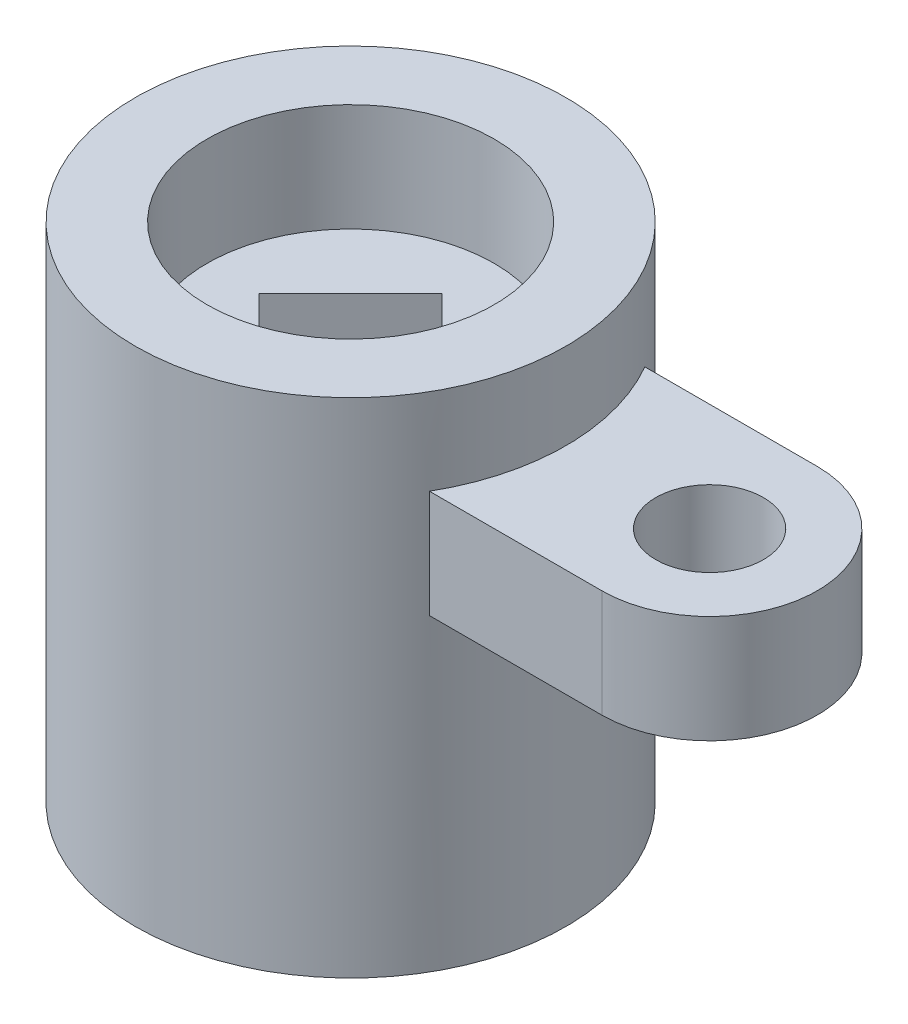
ISO-10303-21;
HEADER;
FILE_DESCRIPTION(('STEP AP214'),'2;1');
FILE_NAME('part.step','',(''),(''),'','','');
FILE_SCHEMA(('AUTOMOTIVE_DESIGN { 1 0 10303 214 1 1 1 1 }'));
ENDSEC;
DATA;
#1=APPLICATION_CONTEXT('core data for automotive mechanical design processes');
#2=APPLICATION_PROTOCOL_DEFINITION('international standard','automotive_design',2000,#1);
#3=PRODUCT_CONTEXT('',#1,'mechanical');
#4=PRODUCT('Part','Part','',(#3));
#5=PRODUCT_RELATED_PRODUCT_CATEGORY('part','',(#4));
#6=PRODUCT_DEFINITION_FORMATION('','',#4);
#7=PRODUCT_DEFINITION_CONTEXT('part definition',#1,'design');
#8=PRODUCT_DEFINITION('design','',#6,#7);
#9=PRODUCT_DEFINITION_SHAPE('','',#8);
#10=(LENGTH_UNIT() NAMED_UNIT(*) SI_UNIT(.MILLI.,.METRE.));
#11=(NAMED_UNIT(*) PLANE_ANGLE_UNIT() SI_UNIT($,.RADIAN.));
#12=(NAMED_UNIT(*) SI_UNIT($,.STERADIAN.) SOLID_ANGLE_UNIT());
#13=UNCERTAINTY_MEASURE_WITH_UNIT(LENGTH_MEASURE(1.E-05),#10,'distance_accuracy_value','');
#14=(GEOMETRIC_REPRESENTATION_CONTEXT(3) GLOBAL_UNCERTAINTY_ASSIGNED_CONTEXT((#13)) GLOBAL_UNIT_ASSIGNED_CONTEXT((#10,
#11,#12)) REPRESENTATION_CONTEXT('',''));
#15=CARTESIAN_POINT('',(0.,0.,0.));
#16=DIRECTION('',(0.,0.,1.));
#17=DIRECTION('',(1.,0.,0.));
#18=AXIS2_PLACEMENT_3D('',#15,#16,#17);
#19=CARTESIAN_POINT('',(0.,70.,0.));
#20=DIRECTION('',(0.,-1.,0.));
#21=DIRECTION('',(0.,0.,-1.));
#22=AXIS2_PLACEMENT_3D('',#19,#20,#21);
#23=CYLINDRICAL_SURFACE('',#22,30.);
#24=CARTESIAN_POINT('',(0.,0.,0.));
#25=DIRECTION('',(0.,1.,0.));
#26=DIRECTION('',(0.,0.,1.));
#27=AXIS2_PLACEMENT_3D('',#24,#25,#26);
#28=CIRCLE('',#27,30.);
#29=CARTESIAN_POINT('',(0.,0.,30.));
#30=VERTEX_POINT('',#29);
#31=EDGE_CURVE('E52',#30,#30,#28,.T.);
#32=ORIENTED_EDGE('',*,*,#31,.T.);
#33=EDGE_LOOP('',(#32));
#34=FACE_BOUND('',#33,.T.);
#35=CARTESIAN_POINT('',(0.,70.,0.));
#36=DIRECTION('',(0.,1.,0.));
#37=DIRECTION('',(0.,0.,1.));
#38=AXIS2_PLACEMENT_3D('',#35,#36,#37);
#39=CIRCLE('',#38,30.);
#40=CARTESIAN_POINT('',(0.,70.,30.));
#41=VERTEX_POINT('',#40);
#42=EDGE_CURVE('E12',#41,#41,#39,.T.);
#43=ORIENTED_EDGE('',*,*,#42,.F.);
#44=EDGE_LOOP('',(#43));
#45=FACE_BOUND('',#44,.T.);
#46=CARTESIAN_POINT('',(0.,43.,0.));
#47=DIRECTION('',(0.,1.,0.));
#48=DIRECTION('',(0.,0.,1.));
#49=AXIS2_PLACEMENT_3D('',#46,#47,#48);
#50=CIRCLE('',#49,30.);
#51=CARTESIAN_POINT('',(25.9807621135332,43.,15.));
#52=VERTEX_POINT('',#51);
#53=CARTESIAN_POINT('',(25.9807621135332,43.,-15.));
#54=VERTEX_POINT('',#53);
#55=EDGE_CURVE('E160',#52,#54,#50,.T.);
#56=ORIENTED_EDGE('',*,*,#55,.F.);
#57=DIRECTION('',(0.,1.,0.));
#58=VECTOR('',#57,1.);
#59=CARTESIAN_POINT('',(25.9807621135332,43.,15.));
#60=LINE('',#59,#58);
#61=CARTESIAN_POINT('',(25.9807621135332,58.,15.));
#62=VERTEX_POINT('',#61);
#63=EDGE_CURVE('E171',#52,#62,#60,.T.);
#64=ORIENTED_EDGE('',*,*,#63,.T.);
#65=CARTESIAN_POINT('',(0.,58.,0.));
#66=DIRECTION('',(0.,1.,0.));
#67=DIRECTION('',(0.,0.,1.));
#68=AXIS2_PLACEMENT_3D('',#65,#66,#67);
#69=CIRCLE('',#68,30.);
#70=CARTESIAN_POINT('',(25.9807621135332,58.,-15.));
#71=VERTEX_POINT('',#70);
#72=EDGE_CURVE('E174',#62,#71,#69,.T.);
#73=ORIENTED_EDGE('',*,*,#72,.T.);
#74=DIRECTION('',(0.,1.,0.));
#75=VECTOR('',#74,1.);
#76=CARTESIAN_POINT('',(25.9807621135332,43.,-15.));
#77=LINE('',#76,#75);
#78=EDGE_CURVE('E183',#54,#71,#77,.T.);
#79=ORIENTED_EDGE('',*,*,#78,.F.);
#80=EDGE_LOOP('',(#56,#64,#73,#79));
#81=FACE_BOUND('',#80,.T.);
#82=ADVANCED_FACE('F49',(#34,#45,#81),#23,.T.);
#83=CARTESIAN_POINT('',(0.,0.,0.));
#84=DIRECTION('',(0.,1.,0.));
#85=DIRECTION('',(0.,0.,1.));
#86=AXIS2_PLACEMENT_3D('',#83,#84,#85);
#87=PLANE('',#86);
#88=DIRECTION('',(-0.707106781186548,0.,-0.707106781186548));
#89=VECTOR('',#88,1.);
#90=CARTESIAN_POINT('',(12.7279220613579,0.,0.));
#91=LINE('',#90,#89);
#92=CARTESIAN_POINT('',(12.7279220613579,0.,0.));
#93=VERTEX_POINT('',#92);
#94=CARTESIAN_POINT('',(0.,0.,-12.7279220613579));
#95=VERTEX_POINT('',#94);
#96=EDGE_CURVE('E124',#93,#95,#91,.T.);
#97=ORIENTED_EDGE('',*,*,#96,.T.);
#98=DIRECTION('',(-0.707106781186547,0.,0.707106781186548));
#99=VECTOR('',#98,1.);
#100=CARTESIAN_POINT('',(-12.7279220613579,0.,0.));
#101=LINE('',#100,#99);
#102=CARTESIAN_POINT('',(-12.7279220613579,0.,0.));
#103=VERTEX_POINT('',#102);
#104=EDGE_CURVE('E116',#95,#103,#101,.T.);
#105=ORIENTED_EDGE('',*,*,#104,.T.);
#106=DIRECTION('',(0.707106781186548,0.,0.707106781186547));
#107=VECTOR('',#106,1.);
#108=CARTESIAN_POINT('',(0.,0.,12.7279220613579));
#109=LINE('',#108,#107);
#110=CARTESIAN_POINT('',(0.,0.,12.7279220613579));
#111=VERTEX_POINT('',#110);
#112=EDGE_CURVE('E127',#103,#111,#109,.T.);
#113=ORIENTED_EDGE('',*,*,#112,.T.);
#114=DIRECTION('',(0.707106781186547,0.,-0.707106781186548));
#115=VECTOR('',#114,1.);
#116=CARTESIAN_POINT('',(0.,0.,12.7279220613579));
#117=LINE('',#116,#115);
#118=EDGE_CURVE('E68',#111,#93,#117,.T.);
#119=ORIENTED_EDGE('',*,*,#118,.T.);
#120=EDGE_LOOP('',(#97,#105,#113,#119));
#121=FACE_BOUND('',#120,.T.);
#122=ORIENTED_EDGE('',*,*,#31,.F.);
#123=EDGE_LOOP('',(#122));
#124=FACE_BOUND('',#123,.T.);
#125=ADVANCED_FACE('F131',(#121,#124),#87,.F.);
#126=CARTESIAN_POINT('',(0.,70.,0.));
#127=DIRECTION('',(0.,1.,0.));
#128=DIRECTION('',(0.,0.,1.));
#129=AXIS2_PLACEMENT_3D('',#126,#127,#128);
#130=PLANE('',#129);
#131=CARTESIAN_POINT('',(0.,70.,0.));
#132=DIRECTION('',(0.,1.,0.));
#133=DIRECTION('',(0.,0.,1.));
#134=AXIS2_PLACEMENT_3D('',#131,#132,#133);
#135=CIRCLE('',#134,20.);
#136=CARTESIAN_POINT('',(0.,70.,20.));
#137=VERTEX_POINT('',#136);
#138=EDGE_CURVE('E147',#137,#137,#135,.T.);
#139=ORIENTED_EDGE('',*,*,#138,.F.);
#140=EDGE_LOOP('',(#139));
#141=FACE_BOUND('',#140,.T.);
#142=ORIENTED_EDGE('',*,*,#42,.T.);
#143=EDGE_LOOP('',(#142));
#144=FACE_BOUND('',#143,.T.);
#145=ADVANCED_FACE('F221',(#141,#144),#130,.T.);
#146=CARTESIAN_POINT('',(0.,43.,-15.));
#147=DIRECTION('',(0.,0.,-1.));
#148=DIRECTION('',(-1.,0.,0.));
#149=AXIS2_PLACEMENT_3D('',#146,#147,#148);
#150=PLANE('',#149);
#151=DIRECTION('',(-1.,0.,0.));
#152=VECTOR('',#151,1.);
#153=CARTESIAN_POINT('',(0.,58.,-15.));
#154=LINE('',#153,#152);
#155=CARTESIAN_POINT('',(50.,58.,-15.));
#156=VERTEX_POINT('',#155);
#157=EDGE_CURVE('E161',#156,#71,#154,.T.);
#158=ORIENTED_EDGE('',*,*,#157,.F.);
#159=DIRECTION('',(0.,1.,0.));
#160=VECTOR('',#159,1.);
#161=CARTESIAN_POINT('',(50.,43.,-15.));
#162=LINE('',#161,#160);
#163=CARTESIAN_POINT('',(50.,43.,-15.));
#164=VERTEX_POINT('',#163);
#165=EDGE_CURVE('E186',#164,#156,#162,.T.);
#166=ORIENTED_EDGE('',*,*,#165,.F.);
#167=DIRECTION('',(-1.,0.,0.));
#168=VECTOR('',#167,1.);
#169=CARTESIAN_POINT('',(0.,43.,-15.));
#170=LINE('',#169,#168);
#171=EDGE_CURVE('E168',#164,#54,#170,.T.);
#172=ORIENTED_EDGE('',*,*,#171,.T.);
#173=ORIENTED_EDGE('',*,*,#78,.T.);
#174=EDGE_LOOP('',(#158,#166,#172,#173));
#175=FACE_BOUND('',#174,.T.);
#176=ADVANCED_FACE('F206',(#175),#150,.T.);
#177=CARTESIAN_POINT('',(50.,43.,0.));
#178=DIRECTION('',(0.,1.,0.));
#179=DIRECTION('',(0.,0.,1.));
#180=AXIS2_PLACEMENT_3D('',#177,#178,#179);
#181=CYLINDRICAL_SURFACE('',#180,15.);
#182=CARTESIAN_POINT('',(50.,58.,0.));
#183=DIRECTION('',(0.,1.,0.));
#184=DIRECTION('',(0.,0.,1.));
#185=AXIS2_PLACEMENT_3D('',#182,#183,#184);
#186=CIRCLE('',#185,15.);
#187=CARTESIAN_POINT('',(50.,58.,15.));
#188=VERTEX_POINT('',#187);
#189=EDGE_CURVE('E179',#188,#156,#186,.T.);
#190=ORIENTED_EDGE('',*,*,#189,.F.);
#191=DIRECTION('',(0.,1.,0.));
#192=VECTOR('',#191,1.);
#193=CARTESIAN_POINT('',(50.,43.,15.));
#194=LINE('',#193,#192);
#195=CARTESIAN_POINT('',(50.,43.,15.));
#196=VERTEX_POINT('',#195);
#197=EDGE_CURVE('E188',#196,#188,#194,.T.);
#198=ORIENTED_EDGE('',*,*,#197,.F.);
#199=CARTESIAN_POINT('',(50.,43.,0.));
#200=DIRECTION('',(0.,1.,0.));
#201=DIRECTION('',(0.,0.,1.));
#202=AXIS2_PLACEMENT_3D('',#199,#200,#201);
#203=CIRCLE('',#202,15.);
#204=EDGE_CURVE('E165',#196,#164,#203,.T.);
#205=ORIENTED_EDGE('',*,*,#204,.T.);
#206=ORIENTED_EDGE('',*,*,#165,.T.);
#207=EDGE_LOOP('',(#190,#198,#205,#206));
#208=FACE_BOUND('',#207,.T.);
#209=ADVANCED_FACE('F211',(#208),#181,.T.);
#210=CARTESIAN_POINT('',(50.,43.,0.));
#211=DIRECTION('',(0.,1.,0.));
#212=DIRECTION('',(0.,0.,1.));
#213=AXIS2_PLACEMENT_3D('',#210,#211,#212);
#214=CYLINDRICAL_SURFACE('',#213,7.5);
#215=CARTESIAN_POINT('',(50.,43.,0.));
#216=DIRECTION('',(0.,1.,0.));
#217=DIRECTION('',(0.,0.,1.));
#218=AXIS2_PLACEMENT_3D('',#215,#216,#217);
#219=CIRCLE('',#218,7.5);
#220=CARTESIAN_POINT('',(50.,43.,7.5));
#221=VERTEX_POINT('',#220);
#222=EDGE_CURVE('E157',#221,#221,#219,.T.);
#223=ORIENTED_EDGE('',*,*,#222,.F.);
#224=EDGE_LOOP('',(#223));
#225=FACE_BOUND('',#224,.T.);
#226=CARTESIAN_POINT('',(50.,58.,0.));
#227=DIRECTION('',(0.,1.,0.));
#228=DIRECTION('',(0.,0.,1.));
#229=AXIS2_PLACEMENT_3D('',#226,#227,#228);
#230=CIRCLE('',#229,7.5);
#231=CARTESIAN_POINT('',(50.,58.,7.5));
#232=VERTEX_POINT('',#231);
#233=EDGE_CURVE('E154',#232,#232,#230,.T.);
#234=ORIENTED_EDGE('',*,*,#233,.T.);
#235=EDGE_LOOP('',(#234));
#236=FACE_BOUND('',#235,.T.);
#237=ADVANCED_FACE('F213',(#225,#236),#214,.F.);
#238=CARTESIAN_POINT('',(0.,43.,15.));
#239=DIRECTION('',(0.,0.,-1.));
#240=DIRECTION('',(-1.,0.,0.));
#241=AXIS2_PLACEMENT_3D('',#238,#239,#240);
#242=PLANE('',#241);
#243=DIRECTION('',(-1.,0.,0.));
#244=VECTOR('',#243,1.);
#245=CARTESIAN_POINT('',(0.,58.,15.));
#246=LINE('',#245,#244);
#247=EDGE_CURVE('E177',#188,#62,#246,.T.);
#248=ORIENTED_EDGE('',*,*,#247,.T.);
#249=ORIENTED_EDGE('',*,*,#63,.F.);
#250=DIRECTION('',(-1.,0.,0.));
#251=VECTOR('',#250,1.);
#252=CARTESIAN_POINT('',(0.,43.,15.));
#253=LINE('',#252,#251);
#254=EDGE_CURVE('E163',#196,#52,#253,.T.);
#255=ORIENTED_EDGE('',*,*,#254,.F.);
#256=ORIENTED_EDGE('',*,*,#197,.T.);
#257=EDGE_LOOP('',(#248,#249,#255,#256));
#258=FACE_BOUND('',#257,.T.);
#259=ADVANCED_FACE('F198',(#258),#242,.F.);
#260=CARTESIAN_POINT('',(0.,43.,0.));
#261=DIRECTION('',(0.,1.,0.));
#262=DIRECTION('',(0.,0.,1.));
#263=AXIS2_PLACEMENT_3D('',#260,#261,#262);
#264=PLANE('',#263);
#265=ORIENTED_EDGE('',*,*,#222,.T.);
#266=EDGE_LOOP('',(#265));
#267=FACE_BOUND('',#266,.T.);
#268=ORIENTED_EDGE('',*,*,#55,.T.);
#269=ORIENTED_EDGE('',*,*,#171,.F.);
#270=ORIENTED_EDGE('',*,*,#204,.F.);
#271=ORIENTED_EDGE('',*,*,#254,.T.);
#272=EDGE_LOOP('',(#268,#269,#270,#271));
#273=FACE_BOUND('',#272,.T.);
#274=ADVANCED_FACE('F209',(#267,#273),#264,.F.);
#275=CARTESIAN_POINT('',(0.,58.,0.));
#276=DIRECTION('',(0.,1.,0.));
#277=DIRECTION('',(0.,0.,1.));
#278=AXIS2_PLACEMENT_3D('',#275,#276,#277);
#279=PLANE('',#278);
#280=ORIENTED_EDGE('',*,*,#233,.F.);
#281=EDGE_LOOP('',(#280));
#282=FACE_BOUND('',#281,.T.);
#283=ORIENTED_EDGE('',*,*,#72,.F.);
#284=ORIENTED_EDGE('',*,*,#247,.F.);
#285=ORIENTED_EDGE('',*,*,#189,.T.);
#286=ORIENTED_EDGE('',*,*,#157,.T.);
#287=EDGE_LOOP('',(#283,#284,#285,#286));
#288=FACE_BOUND('',#287,.T.);
#289=ADVANCED_FACE('F203',(#282,#288),#279,.T.);
#290=CARTESIAN_POINT('',(0.,55.,0.));
#291=DIRECTION('',(0.,1.,0.));
#292=DIRECTION('',(0.,0.,1.));
#293=AXIS2_PLACEMENT_3D('',#290,#291,#292);
#294=CYLINDRICAL_SURFACE('',#293,20.);
#295=CARTESIAN_POINT('',(0.,55.,0.));
#296=DIRECTION('',(0.,1.,0.));
#297=DIRECTION('',(0.,0.,1.));
#298=AXIS2_PLACEMENT_3D('',#295,#296,#297);
#299=CIRCLE('',#298,20.);
#300=CARTESIAN_POINT('',(0.,55.,20.));
#301=VERTEX_POINT('',#300);
#302=EDGE_CURVE('E151',#301,#301,#299,.T.);
#303=ORIENTED_EDGE('',*,*,#302,.F.);
#304=EDGE_LOOP('',(#303));
#305=FACE_BOUND('',#304,.T.);
#306=ORIENTED_EDGE('',*,*,#138,.T.);
#307=EDGE_LOOP('',(#306));
#308=FACE_BOUND('',#307,.T.);
#309=ADVANCED_FACE('F250',(#305,#308),#294,.F.);
#310=CARTESIAN_POINT('',(0.,55.,0.));
#311=DIRECTION('',(0.,1.,0.));
#312=DIRECTION('',(0.,0.,1.));
#313=AXIS2_PLACEMENT_3D('',#310,#311,#312);
#314=PLANE('',#313);
#315=DIRECTION('',(-0.707106781186547,0.,0.707106781186548));
#316=VECTOR('',#315,1.);
#317=CARTESIAN_POINT('',(-12.7279220613579,55.,0.));
#318=LINE('',#317,#316);
#319=CARTESIAN_POINT('',(0.,55.,-12.7279220613579));
#320=VERTEX_POINT('',#319);
#321=CARTESIAN_POINT('',(-12.7279220613579,55.,0.));
#322=VERTEX_POINT('',#321);
#323=EDGE_CURVE('E119',#320,#322,#318,.T.);
#324=ORIENTED_EDGE('',*,*,#323,.F.);
#325=DIRECTION('',(-0.707106781186548,0.,-0.707106781186548));
#326=VECTOR('',#325,1.);
#327=CARTESIAN_POINT('',(12.7279220613579,55.,0.));
#328=LINE('',#327,#326);
#329=CARTESIAN_POINT('',(12.7279220613579,55.,0.));
#330=VERTEX_POINT('',#329);
#331=EDGE_CURVE('E134',#330,#320,#328,.T.);
#332=ORIENTED_EDGE('',*,*,#331,.F.);
#333=DIRECTION('',(0.707106781186547,0.,-0.707106781186548));
#334=VECTOR('',#333,1.);
#335=CARTESIAN_POINT('',(0.,55.,12.7279220613579));
#336=LINE('',#335,#334);
#337=CARTESIAN_POINT('',(0.,55.,12.7279220613579));
#338=VERTEX_POINT('',#337);
#339=EDGE_CURVE('E63',#338,#330,#336,.T.);
#340=ORIENTED_EDGE('',*,*,#339,.F.);
#341=DIRECTION('',(0.707106781186548,0.,0.707106781186547));
#342=VECTOR('',#341,1.);
#343=CARTESIAN_POINT('',(0.,55.,12.7279220613579));
#344=LINE('',#343,#342);
#345=EDGE_CURVE('E142',#322,#338,#344,.T.);
#346=ORIENTED_EDGE('',*,*,#345,.F.);
#347=EDGE_LOOP('',(#324,#332,#340,#346));
#348=FACE_BOUND('',#347,.T.);
#349=ORIENTED_EDGE('',*,*,#302,.T.);
#350=EDGE_LOOP('',(#349));
#351=FACE_BOUND('',#350,.T.);
#352=ADVANCED_FACE('F255',(#348,#351),#314,.T.);
#353=CARTESIAN_POINT('',(-12.7279220613579,0.,0.));
#354=DIRECTION('',(-0.707106781186548,0.,-0.707106781186547));
#355=DIRECTION('',(-0.707106781186547,0.,0.707106781186548));
#356=AXIS2_PLACEMENT_3D('',#353,#354,#355);
#357=PLANE('',#356);
#358=ORIENTED_EDGE('',*,*,#323,.T.);
#359=DIRECTION('',(0.,1.,0.));
#360=VECTOR('',#359,1.);
#361=CARTESIAN_POINT('',(-12.7279220613579,0.,0.));
#362=LINE('',#361,#360);
#363=EDGE_CURVE('E112',#103,#322,#362,.T.);
#364=ORIENTED_EDGE('',*,*,#363,.F.);
#365=ORIENTED_EDGE('',*,*,#104,.F.);
#366=DIRECTION('',(0.,1.,0.));
#367=VECTOR('',#366,1.);
#368=CARTESIAN_POINT('',(0.,0.,-12.7279220613579));
#369=LINE('',#368,#367);
#370=EDGE_CURVE('E145',#95,#320,#369,.T.);
#371=ORIENTED_EDGE('',*,*,#370,.T.);
#372=EDGE_LOOP('',(#358,#364,#365,#371));
#373=FACE_BOUND('',#372,.T.);
#374=ADVANCED_FACE('F114',(#373),#357,.F.);
#375=CARTESIAN_POINT('',(12.7279220613579,0.,0.));
#376=DIRECTION('',(0.707106781186547,0.,-0.707106781186548));
#377=DIRECTION('',(-0.707106781186548,0.,-0.707106781186547));
#378=AXIS2_PLACEMENT_3D('',#375,#376,#377);
#379=PLANE('',#378);
#380=ORIENTED_EDGE('',*,*,#331,.T.);
#381=ORIENTED_EDGE('',*,*,#370,.F.);
#382=ORIENTED_EDGE('',*,*,#96,.F.);
#383=DIRECTION('',(0.,1.,0.));
#384=VECTOR('',#383,1.);
#385=CARTESIAN_POINT('',(12.7279220613579,0.,0.));
#386=LINE('',#385,#384);
#387=EDGE_CURVE('E148',#93,#330,#386,.T.);
#388=ORIENTED_EDGE('',*,*,#387,.T.);
#389=EDGE_LOOP('',(#380,#381,#382,#388));
#390=FACE_BOUND('',#389,.T.);
#391=ADVANCED_FACE('F262',(#390),#379,.F.);
#392=CARTESIAN_POINT('',(0.,0.,12.7279220613579));
#393=DIRECTION('',(0.707106781186548,0.,0.707106781186547));
#394=DIRECTION('',(0.707106781186547,0.,-0.707106781186548));
#395=AXIS2_PLACEMENT_3D('',#392,#393,#394);
#396=PLANE('',#395);
#397=ORIENTED_EDGE('',*,*,#339,.T.);
#398=ORIENTED_EDGE('',*,*,#387,.F.);
#399=ORIENTED_EDGE('',*,*,#118,.F.);
#400=DIRECTION('',(0.,1.,0.));
#401=VECTOR('',#400,1.);
#402=CARTESIAN_POINT('',(0.,0.,12.7279220613579));
#403=LINE('',#402,#401);
#404=EDGE_CURVE('E123',#111,#338,#403,.T.);
#405=ORIENTED_EDGE('',*,*,#404,.T.);
#406=EDGE_LOOP('',(#397,#398,#399,#405));
#407=FACE_BOUND('',#406,.T.);
#408=ADVANCED_FACE('F265',(#407),#396,.F.);
#409=CARTESIAN_POINT('',(0.,0.,12.7279220613579));
#410=DIRECTION('',(-0.707106781186547,0.,0.707106781186548));
#411=DIRECTION('',(0.707106781186548,0.,0.707106781186547));
#412=AXIS2_PLACEMENT_3D('',#409,#410,#411);
#413=PLANE('',#412);
#414=ORIENTED_EDGE('',*,*,#345,.T.);
#415=ORIENTED_EDGE('',*,*,#404,.F.);
#416=ORIENTED_EDGE('',*,*,#112,.F.);
#417=ORIENTED_EDGE('',*,*,#363,.T.);
#418=EDGE_LOOP('',(#414,#415,#416,#417));
#419=FACE_BOUND('',#418,.T.);
#420=ADVANCED_FACE('F128',(#419),#413,.F.);
#421=CLOSED_SHELL('',(#82,#125,#145,#176,#209,#237,#259,#274,#289,#309,#352,#374,#391,#408,#420));
#422=MANIFOLD_SOLID_BREP('B2',#421);
#423=ADVANCED_BREP_SHAPE_REPRESENTATION('',(#18,#422),#14);
#424=SHAPE_DEFINITION_REPRESENTATION(#9,#423);
ENDSEC;
END-ISO-10303-21;
